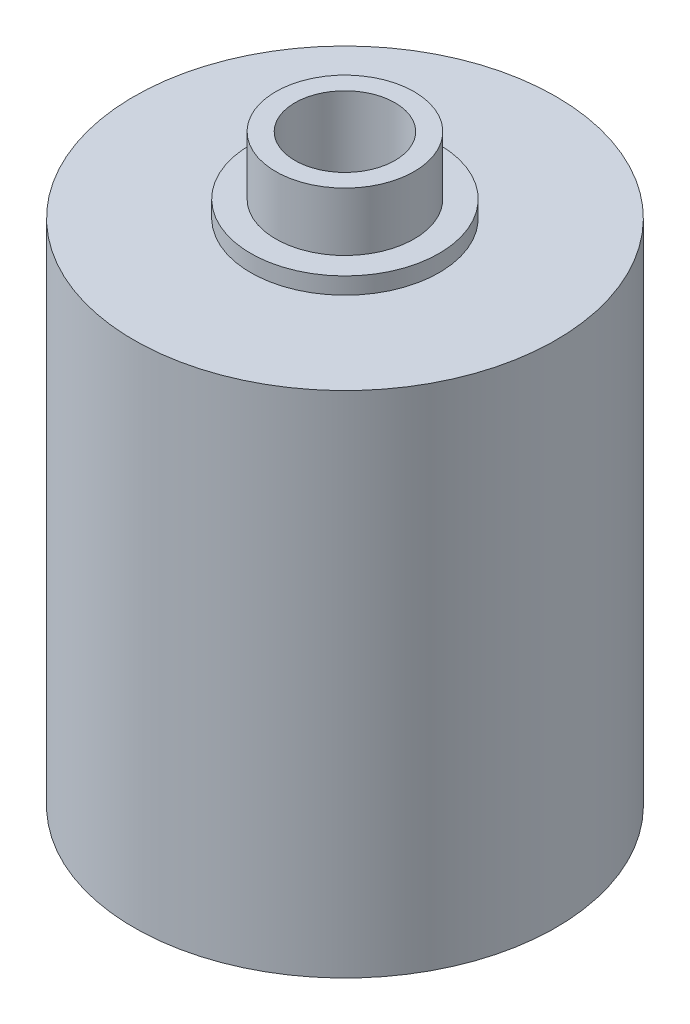
ISO-10303-21;
HEADER;
FILE_DESCRIPTION(('STEP AP214'),'2;1');
FILE_NAME('part.step','',(''),(''),'','','');
FILE_SCHEMA(('AUTOMOTIVE_DESIGN { 1 0 10303 214 1 1 1 1 }'));
ENDSEC;
DATA;
#1=APPLICATION_CONTEXT('core data for automotive mechanical design processes');
#2=APPLICATION_PROTOCOL_DEFINITION('international standard','automotive_design',2000,#1);
#3=PRODUCT_CONTEXT('',#1,'mechanical');
#4=PRODUCT('Part','Part','',(#3));
#5=PRODUCT_RELATED_PRODUCT_CATEGORY('part','',(#4));
#6=PRODUCT_DEFINITION_FORMATION('','',#4);
#7=PRODUCT_DEFINITION_CONTEXT('part definition',#1,'design');
#8=PRODUCT_DEFINITION('design','',#6,#7);
#9=PRODUCT_DEFINITION_SHAPE('','',#8);
#10=(LENGTH_UNIT() NAMED_UNIT(*) SI_UNIT(.MILLI.,.METRE.));
#11=(NAMED_UNIT(*) PLANE_ANGLE_UNIT() SI_UNIT($,.RADIAN.));
#12=(NAMED_UNIT(*) SI_UNIT($,.STERADIAN.) SOLID_ANGLE_UNIT());
#13=UNCERTAINTY_MEASURE_WITH_UNIT(LENGTH_MEASURE(1.E-05),#10,'distance_accuracy_value','');
#14=(GEOMETRIC_REPRESENTATION_CONTEXT(3) GLOBAL_UNCERTAINTY_ASSIGNED_CONTEXT((#13)) GLOBAL_UNIT_ASSIGNED_CONTEXT((#10,
#11,#12)) REPRESENTATION_CONTEXT('',''));
#15=CARTESIAN_POINT('',(0.,0.,0.));
#16=DIRECTION('',(0.,0.,1.));
#17=DIRECTION('',(1.,0.,0.));
#18=AXIS2_PLACEMENT_3D('',#15,#16,#17);
#19=CARTESIAN_POINT('',(0.,0.,0.));
#20=DIRECTION('',(0.,-1.,0.));
#21=DIRECTION('',(0.,0.,-1.));
#22=AXIS2_PLACEMENT_3D('',#19,#20,#21);
#23=CYLINDRICAL_SURFACE('',#22,3.);
#24=CARTESIAN_POINT('',(0.,35.,0.));
#25=DIRECTION('',(0.,-1.,0.));
#26=DIRECTION('',(0.,0.,-1.));
#27=AXIS2_PLACEMENT_3D('',#24,#25,#26);
#28=CIRCLE('',#27,3.);
#29=CARTESIAN_POINT('',(0.,35.,-3.));
#30=VERTEX_POINT('',#29);
#31=EDGE_CURVE('E11',#30,#30,#28,.T.);
#32=ORIENTED_EDGE('',*,*,#31,.F.);
#33=EDGE_LOOP('',(#32));
#34=FACE_BOUND('',#33,.T.);
#35=CARTESIAN_POINT('',(0.,25.,0.));
#36=DIRECTION('',(0.,-1.,0.));
#37=DIRECTION('',(0.,0.,-1.));
#38=AXIS2_PLACEMENT_3D('',#35,#36,#37);
#39=CIRCLE('',#38,3.);
#40=CARTESIAN_POINT('',(0.,25.,-3.));
#41=VERTEX_POINT('',#40);
#42=EDGE_CURVE('E38',#41,#41,#39,.T.);
#43=ORIENTED_EDGE('',*,*,#42,.T.);
#44=EDGE_LOOP('',(#43));
#45=FACE_BOUND('',#44,.T.);
#46=ADVANCED_FACE('F35',(#34,#45),#23,.F.);
#47=CARTESIAN_POINT('',(3.,35.,0.));
#48=DIRECTION('',(0.,1.,0.));
#49=DIRECTION('',(0.,0.,1.));
#50=AXIS2_PLACEMENT_3D('',#47,#48,#49);
#51=PLANE('',#50);
#52=ORIENTED_EDGE('',*,*,#31,.T.);
#53=EDGE_LOOP('',(#52));
#54=FACE_BOUND('',#53,.T.);
#55=CARTESIAN_POINT('',(0.,35.,0.));
#56=DIRECTION('',(0.,-1.,0.));
#57=DIRECTION('',(0.,0.,-1.));
#58=AXIS2_PLACEMENT_3D('',#55,#56,#57);
#59=CIRCLE('',#58,4.15);
#60=CARTESIAN_POINT('',(0.,35.,-4.15));
#61=VERTEX_POINT('',#60);
#62=EDGE_CURVE('E43',#61,#61,#59,.T.);
#63=ORIENTED_EDGE('',*,*,#62,.F.);
#64=EDGE_LOOP('',(#63));
#65=FACE_BOUND('',#64,.T.);
#66=ADVANCED_FACE('F134',(#54,#65),#51,.T.);
#67=CARTESIAN_POINT('',(0.,0.,0.));
#68=DIRECTION('',(0.,-1.,0.));
#69=DIRECTION('',(0.,0.,-1.));
#70=AXIS2_PLACEMENT_3D('',#67,#68,#69);
#71=CYLINDRICAL_SURFACE('',#70,4.15);
#72=ORIENTED_EDGE('',*,*,#62,.T.);
#73=EDGE_LOOP('',(#72));
#74=FACE_BOUND('',#73,.T.);
#75=CARTESIAN_POINT('',(0.,31.5,0.));
#76=DIRECTION('',(0.,-1.,0.));
#77=DIRECTION('',(0.,0.,-1.));
#78=AXIS2_PLACEMENT_3D('',#75,#76,#77);
#79=CIRCLE('',#78,4.15);
#80=CARTESIAN_POINT('',(0.,31.5,-4.15));
#81=VERTEX_POINT('',#80);
#82=EDGE_CURVE('E125',#81,#81,#79,.T.);
#83=ORIENTED_EDGE('',*,*,#82,.F.);
#84=EDGE_LOOP('',(#83));
#85=FACE_BOUND('',#84,.T.);
#86=ADVANCED_FACE('F131',(#74,#85),#71,.T.);
#87=CARTESIAN_POINT('',(4.15,31.5,0.));
#88=DIRECTION('',(0.,1.,0.));
#89=DIRECTION('',(0.,0.,1.));
#90=AXIS2_PLACEMENT_3D('',#87,#88,#89);
#91=PLANE('',#90);
#92=ORIENTED_EDGE('',*,*,#82,.T.);
#93=EDGE_LOOP('',(#92));
#94=FACE_BOUND('',#93,.T.);
#95=CARTESIAN_POINT('',(0.,31.5,0.));
#96=DIRECTION('',(0.,-1.,0.));
#97=DIRECTION('',(0.,0.,-1.));
#98=AXIS2_PLACEMENT_3D('',#95,#96,#97);
#99=CIRCLE('',#98,5.65);
#100=CARTESIAN_POINT('',(0.,31.5,-5.65));
#101=VERTEX_POINT('',#100);
#102=EDGE_CURVE('E122',#101,#101,#99,.T.);
#103=ORIENTED_EDGE('',*,*,#102,.F.);
#104=EDGE_LOOP('',(#103));
#105=FACE_BOUND('',#104,.T.);
#106=ADVANCED_FACE('F141',(#94,#105),#91,.T.);
#107=CARTESIAN_POINT('',(0.,0.,0.));
#108=DIRECTION('',(0.,-1.,0.));
#109=DIRECTION('',(0.,0.,-1.));
#110=AXIS2_PLACEMENT_3D('',#107,#108,#109);
#111=CYLINDRICAL_SURFACE('',#110,5.65);
#112=ORIENTED_EDGE('',*,*,#102,.T.);
#113=EDGE_LOOP('',(#112));
#114=FACE_BOUND('',#113,.T.);
#115=CARTESIAN_POINT('',(0.,30.5,0.));
#116=DIRECTION('',(0.,-1.,0.));
#117=DIRECTION('',(0.,0.,-1.));
#118=AXIS2_PLACEMENT_3D('',#115,#116,#117);
#119=CIRCLE('',#118,5.65);
#120=CARTESIAN_POINT('',(0.,30.5,-5.65));
#121=VERTEX_POINT('',#120);
#122=EDGE_CURVE('E119',#121,#121,#119,.T.);
#123=ORIENTED_EDGE('',*,*,#122,.F.);
#124=EDGE_LOOP('',(#123));
#125=FACE_BOUND('',#124,.T.);
#126=ADVANCED_FACE('F147',(#114,#125),#111,.T.);
#127=CARTESIAN_POINT('',(5.65,30.5,0.));
#128=DIRECTION('',(0.,1.,0.));
#129=DIRECTION('',(0.,0.,1.));
#130=AXIS2_PLACEMENT_3D('',#127,#128,#129);
#131=PLANE('',#130);
#132=ORIENTED_EDGE('',*,*,#122,.T.);
#133=EDGE_LOOP('',(#132));
#134=FACE_BOUND('',#133,.T.);
#135=CARTESIAN_POINT('',(0.,30.5,0.));
#136=DIRECTION('',(0.,-1.,0.));
#137=DIRECTION('',(0.,0.,-1.));
#138=AXIS2_PLACEMENT_3D('',#135,#136,#137);
#139=CIRCLE('',#138,12.65);
#140=CARTESIAN_POINT('',(0.,30.5,-12.65));
#141=VERTEX_POINT('',#140);
#142=EDGE_CURVE('E116',#141,#141,#139,.T.);
#143=ORIENTED_EDGE('',*,*,#142,.F.);
#144=EDGE_LOOP('',(#143));
#145=FACE_BOUND('',#144,.T.);
#146=ADVANCED_FACE('F151',(#134,#145),#131,.T.);
#147=CARTESIAN_POINT('',(0.,0.,0.));
#148=DIRECTION('',(0.,-1.,0.));
#149=DIRECTION('',(0.,0.,-1.));
#150=AXIS2_PLACEMENT_3D('',#147,#148,#149);
#151=CYLINDRICAL_SURFACE('',#150,12.65);
#152=ORIENTED_EDGE('',*,*,#142,.T.);
#153=EDGE_LOOP('',(#152));
#154=FACE_BOUND('',#153,.T.);
#155=CARTESIAN_POINT('',(0.,0.,0.));
#156=DIRECTION('',(0.,-1.,0.));
#157=DIRECTION('',(0.,0.,-1.));
#158=AXIS2_PLACEMENT_3D('',#155,#156,#157);
#159=CIRCLE('',#158,12.65);
#160=CARTESIAN_POINT('',(0.,0.,-12.65));
#161=VERTEX_POINT('',#160);
#162=EDGE_CURVE('E113',#161,#161,#159,.T.);
#163=ORIENTED_EDGE('',*,*,#162,.F.);
#164=EDGE_LOOP('',(#163));
#165=FACE_BOUND('',#164,.T.);
#166=ADVANCED_FACE('F155',(#154,#165),#151,.T.);
#167=CARTESIAN_POINT('',(12.65,0.,0.));
#168=DIRECTION('',(0.,-1.,0.));
#169=DIRECTION('',(0.,0.,-1.));
#170=AXIS2_PLACEMENT_3D('',#167,#168,#169);
#171=PLANE('',#170);
#172=DIRECTION('',(0.,0.,1.));
#173=VECTOR('',#172,1.);
#174=CARTESIAN_POINT('',(7.6,0.,7.6));
#175=LINE('',#174,#173);
#176=CARTESIAN_POINT('',(7.6,0.,-7.6));
#177=VERTEX_POINT('',#176);
#178=CARTESIAN_POINT('',(7.6,0.,7.6));
#179=VERTEX_POINT('',#178);
#180=EDGE_CURVE('E50',#177,#179,#175,.T.);
#181=ORIENTED_EDGE('',*,*,#180,.F.);
#182=DIRECTION('',(1.,0.,0.));
#183=VECTOR('',#182,1.);
#184=CARTESIAN_POINT('',(-7.6,0.,-7.6));
#185=LINE('',#184,#183);
#186=CARTESIAN_POINT('',(-7.6,0.,-7.6));
#187=VERTEX_POINT('',#186);
#188=EDGE_CURVE('E101',#187,#177,#185,.T.);
#189=ORIENTED_EDGE('',*,*,#188,.F.);
#190=DIRECTION('',(0.,0.,-1.));
#191=VECTOR('',#190,1.);
#192=CARTESIAN_POINT('',(-7.6,0.,7.6));
#193=LINE('',#192,#191);
#194=CARTESIAN_POINT('',(-7.6,0.,7.6));
#195=VERTEX_POINT('',#194);
#196=EDGE_CURVE('E107',#195,#187,#193,.T.);
#197=ORIENTED_EDGE('',*,*,#196,.F.);
#198=DIRECTION('',(-1.,0.,0.));
#199=VECTOR('',#198,1.);
#200=CARTESIAN_POINT('',(-7.6,0.,7.6));
#201=LINE('',#200,#199);
#202=EDGE_CURVE('E85',#179,#195,#201,.T.);
#203=ORIENTED_EDGE('',*,*,#202,.F.);
#204=EDGE_LOOP('',(#181,#189,#197,#203));
#205=FACE_BOUND('',#204,.T.);
#206=ORIENTED_EDGE('',*,*,#162,.T.);
#207=EDGE_LOOP('',(#206));
#208=FACE_BOUND('',#207,.T.);
#209=ADVANCED_FACE('F159',(#205,#208),#171,.T.);
#210=CARTESIAN_POINT('',(7.6,25.,7.6));
#211=DIRECTION('',(1.,0.,0.));
#212=DIRECTION('',(0.,0.,-1.));
#213=AXIS2_PLACEMENT_3D('',#210,#211,#212);
#214=PLANE('',#213);
#215=ORIENTED_EDGE('',*,*,#180,.T.);
#216=DIRECTION('',(0.,-1.,0.));
#217=VECTOR('',#216,1.);
#218=CARTESIAN_POINT('',(7.6,25.,7.6));
#219=LINE('',#218,#217);
#220=CARTESIAN_POINT('',(7.6,25.,7.6));
#221=VERTEX_POINT('',#220);
#222=EDGE_CURVE('E73',#221,#179,#219,.T.);
#223=ORIENTED_EDGE('',*,*,#222,.F.);
#224=DIRECTION('',(0.,0.,1.));
#225=VECTOR('',#224,1.);
#226=CARTESIAN_POINT('',(7.6,25.,7.6));
#227=LINE('',#226,#225);
#228=CARTESIAN_POINT('',(7.6,25.,-7.6));
#229=VERTEX_POINT('',#228);
#230=EDGE_CURVE('E99',#229,#221,#227,.T.);
#231=ORIENTED_EDGE('',*,*,#230,.F.);
#232=DIRECTION('',(0.,-1.,0.));
#233=VECTOR('',#232,1.);
#234=CARTESIAN_POINT('',(7.6,25.,-7.6));
#235=LINE('',#234,#233);
#236=EDGE_CURVE('E58',#229,#177,#235,.T.);
#237=ORIENTED_EDGE('',*,*,#236,.T.);
#238=EDGE_LOOP('',(#215,#223,#231,#237));
#239=FACE_BOUND('',#238,.T.);
#240=ADVANCED_FACE('F163',(#239),#214,.F.);
#241=CARTESIAN_POINT('',(-7.6,25.,-7.6));
#242=DIRECTION('',(0.,0.,-1.));
#243=DIRECTION('',(-1.,0.,0.));
#244=AXIS2_PLACEMENT_3D('',#241,#242,#243);
#245=PLANE('',#244);
#246=ORIENTED_EDGE('',*,*,#188,.T.);
#247=ORIENTED_EDGE('',*,*,#236,.F.);
#248=DIRECTION('',(1.,0.,0.));
#249=VECTOR('',#248,1.);
#250=CARTESIAN_POINT('',(-7.6,25.,-7.6));
#251=LINE('',#250,#249);
#252=CARTESIAN_POINT('',(-7.6,25.,-7.6));
#253=VERTEX_POINT('',#252);
#254=EDGE_CURVE('E96',#253,#229,#251,.T.);
#255=ORIENTED_EDGE('',*,*,#254,.F.);
#256=DIRECTION('',(0.,-1.,0.));
#257=VECTOR('',#256,1.);
#258=CARTESIAN_POINT('',(-7.6,25.,-7.6));
#259=LINE('',#258,#257);
#260=EDGE_CURVE('E89',#253,#187,#259,.T.);
#261=ORIENTED_EDGE('',*,*,#260,.T.);
#262=EDGE_LOOP('',(#246,#247,#255,#261));
#263=FACE_BOUND('',#262,.T.);
#264=ADVANCED_FACE('F167',(#263),#245,.F.);
#265=CARTESIAN_POINT('',(-7.6,25.,7.6));
#266=DIRECTION('',(-1.,0.,0.));
#267=DIRECTION('',(0.,0.,1.));
#268=AXIS2_PLACEMENT_3D('',#265,#266,#267);
#269=PLANE('',#268);
#270=ORIENTED_EDGE('',*,*,#196,.T.);
#271=ORIENTED_EDGE('',*,*,#260,.F.);
#272=DIRECTION('',(0.,0.,-1.));
#273=VECTOR('',#272,1.);
#274=CARTESIAN_POINT('',(-7.6,25.,7.6));
#275=LINE('',#274,#273);
#276=CARTESIAN_POINT('',(-7.6,25.,7.6));
#277=VERTEX_POINT('',#276);
#278=EDGE_CURVE('E92',#277,#253,#275,.T.);
#279=ORIENTED_EDGE('',*,*,#278,.F.);
#280=DIRECTION('',(0.,-1.,0.));
#281=VECTOR('',#280,1.);
#282=CARTESIAN_POINT('',(-7.6,25.,7.6));
#283=LINE('',#282,#281);
#284=EDGE_CURVE('E78',#277,#195,#283,.T.);
#285=ORIENTED_EDGE('',*,*,#284,.T.);
#286=EDGE_LOOP('',(#270,#271,#279,#285));
#287=FACE_BOUND('',#286,.T.);
#288=ADVANCED_FACE('F93',(#287),#269,.F.);
#289=CARTESIAN_POINT('',(-7.6,25.,7.6));
#290=DIRECTION('',(0.,0.,1.));
#291=DIRECTION('',(1.,0.,0.));
#292=AXIS2_PLACEMENT_3D('',#289,#290,#291);
#293=PLANE('',#292);
#294=ORIENTED_EDGE('',*,*,#202,.T.);
#295=ORIENTED_EDGE('',*,*,#284,.F.);
#296=DIRECTION('',(-1.,0.,0.));
#297=VECTOR('',#296,1.);
#298=CARTESIAN_POINT('',(-7.6,25.,7.6));
#299=LINE('',#298,#297);
#300=EDGE_CURVE('E82',#221,#277,#299,.T.);
#301=ORIENTED_EDGE('',*,*,#300,.F.);
#302=ORIENTED_EDGE('',*,*,#222,.T.);
#303=EDGE_LOOP('',(#294,#295,#301,#302));
#304=FACE_BOUND('',#303,.T.);
#305=ADVANCED_FACE('F80',(#304),#293,.F.);
#306=CARTESIAN_POINT('',(0.,25.,0.));
#307=DIRECTION('',(0.,-1.,0.));
#308=DIRECTION('',(0.,0.,-1.));
#309=AXIS2_PLACEMENT_3D('',#306,#307,#308);
#310=PLANE('',#309);
#311=ORIENTED_EDGE('',*,*,#42,.F.);
#312=EDGE_LOOP('',(#311));
#313=FACE_BOUND('',#312,.T.);
#314=ORIENTED_EDGE('',*,*,#230,.T.);
#315=ORIENTED_EDGE('',*,*,#300,.T.);
#316=ORIENTED_EDGE('',*,*,#278,.T.);
#317=ORIENTED_EDGE('',*,*,#254,.T.);
#318=EDGE_LOOP('',(#314,#315,#316,#317));
#319=FACE_BOUND('',#318,.T.);
#320=ADVANCED_FACE('F98',(#313,#319),#310,.T.);
#321=CLOSED_SHELL('',(#46,#66,#86,#106,#126,#146,#166,#209,#240,#264,#288,#305,#320));
#322=MANIFOLD_SOLID_BREP('B2',#321);
#323=ADVANCED_BREP_SHAPE_REPRESENTATION('',(#18,#322),#14);
#324=SHAPE_DEFINITION_REPRESENTATION(#9,#323);
ENDSEC;
END-ISO-10303-21;
